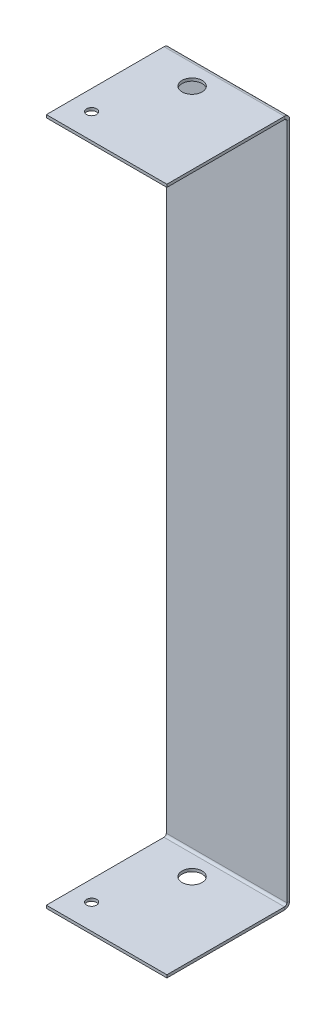
ISO-10303-21;
HEADER;
FILE_DESCRIPTION(('STEP AP214'),'2;1');
FILE_NAME('part.step','',(''),(''),'','','');
FILE_SCHEMA(('AUTOMOTIVE_DESIGN { 1 0 10303 214 1 1 1 1 }'));
ENDSEC;
DATA;
#1=APPLICATION_CONTEXT('core data for automotive mechanical design processes');
#2=APPLICATION_PROTOCOL_DEFINITION('international standard','automotive_design',2000,#1);
#3=PRODUCT_CONTEXT('',#1,'mechanical');
#4=PRODUCT('Part','Part','',(#3));
#5=PRODUCT_RELATED_PRODUCT_CATEGORY('part','',(#4));
#6=PRODUCT_DEFINITION_FORMATION('','',#4);
#7=PRODUCT_DEFINITION_CONTEXT('part definition',#1,'design');
#8=PRODUCT_DEFINITION('design','',#6,#7);
#9=PRODUCT_DEFINITION_SHAPE('','',#8);
#10=(LENGTH_UNIT() NAMED_UNIT(*) SI_UNIT(.MILLI.,.METRE.));
#11=(NAMED_UNIT(*) PLANE_ANGLE_UNIT() SI_UNIT($,.RADIAN.));
#12=(NAMED_UNIT(*) SI_UNIT($,.STERADIAN.) SOLID_ANGLE_UNIT());
#13=UNCERTAINTY_MEASURE_WITH_UNIT(LENGTH_MEASURE(1.E-05),#10,'distance_accuracy_value','');
#14=(GEOMETRIC_REPRESENTATION_CONTEXT(3) GLOBAL_UNCERTAINTY_ASSIGNED_CONTEXT((#13)) GLOBAL_UNIT_ASSIGNED_CONTEXT((#10,
#11,#12)) REPRESENTATION_CONTEXT('',''));
#15=CARTESIAN_POINT('',(0.,0.,0.));
#16=DIRECTION('',(0.,0.,1.));
#17=DIRECTION('',(1.,0.,0.));
#18=AXIS2_PLACEMENT_3D('',#15,#16,#17);
#19=CARTESIAN_POINT('',(0.,-107.758966229212,-108.141033770789));
#20=DIRECTION('',(0.,-1.,0.));
#21=DIRECTION('',(-1.,0.,0.));
#22=AXIS2_PLACEMENT_3D('',#19,#20,#21);
#23=PLANE('',#22);
#24=CARTESIAN_POINT('',(-12.6999999999976,-107.758966229211,29.9465999999943));
#25=DIRECTION('',(0.,1.,0.));
#26=DIRECTION('',(0.,0.,1.));
#27=AXIS2_PLACEMENT_3D('',#24,#25,#26);
#28=CIRCLE('',#27,1.58749999999999);
#29=CARTESIAN_POINT('',(-12.6999999999976,-107.758966229211,31.5340999999943));
#30=VERTEX_POINT('',#29);
#31=EDGE_CURVE('E337',#30,#30,#28,.T.);
#32=ORIENTED_EDGE('',*,*,#31,.F.);
#33=EDGE_LOOP('',(#32));
#34=FACE_BOUND('',#33,.T.);
#35=DIRECTION('',(0.,0.,-1.));
#36=VECTOR('',#35,1.);
#37=CARTESIAN_POINT('',(19.05,-107.758966229211,37.9089662292112));
#38=LINE('',#37,#36);
#39=CARTESIAN_POINT('',(19.05,-107.758966229211,37.9089662292112));
#40=VERTEX_POINT('',#39);
#41=CARTESIAN_POINT('',(19.05,-107.758966229211,0.736600000000004));
#42=VERTEX_POINT('',#41);
#43=EDGE_CURVE('E302',#40,#42,#38,.T.);
#44=ORIENTED_EDGE('',*,*,#43,.T.);
#45=DIRECTION('',(-1.,0.,0.));
#46=VECTOR('',#45,1.);
#47=CARTESIAN_POINT('',(0.,-107.758966229211,0.736600000000004));
#48=LINE('',#47,#46);
#49=CARTESIAN_POINT('',(-19.05,-107.758966229211,0.736600000000004));
#50=VERTEX_POINT('',#49);
#51=EDGE_CURVE('E309',#42,#50,#48,.T.);
#52=ORIENTED_EDGE('',*,*,#51,.T.);
#53=DIRECTION('',(0.,0.,1.));
#54=VECTOR('',#53,1.);
#55=CARTESIAN_POINT('',(-19.05,-107.758966229211,37.9089662292112));
#56=LINE('',#55,#54);
#57=CARTESIAN_POINT('',(-19.05,-107.758966229211,37.9089662292112));
#58=VERTEX_POINT('',#57);
#59=EDGE_CURVE('E311',#50,#58,#56,.T.);
#60=ORIENTED_EDGE('',*,*,#59,.T.);
#61=DIRECTION('',(1.,0.,0.));
#62=VECTOR('',#61,1.);
#63=CARTESIAN_POINT('',(-19.05,-107.758966229211,37.9089662292112));
#64=LINE('',#63,#62);
#65=EDGE_CURVE('E152',#58,#40,#64,.T.);
#66=ORIENTED_EDGE('',*,*,#65,.T.);
#67=EDGE_LOOP('',(#44,#52,#60,#66));
#68=FACE_BOUND('',#67,.T.);
#69=CARTESIAN_POINT('',(-3.80999999999361,-107.758966229211,7.08660000000428));
#70=DIRECTION('',(0.,1.,0.));
#71=DIRECTION('',(0.,0.,1.));
#72=AXIS2_PLACEMENT_3D('',#69,#70,#71);
#73=CIRCLE('',#72,3.17499999999999);
#74=CARTESIAN_POINT('',(-3.80999999999361,-107.758966229211,10.2616000000043));
#75=VERTEX_POINT('',#74);
#76=EDGE_CURVE('E331',#75,#75,#73,.T.);
#77=ORIENTED_EDGE('',*,*,#76,.F.);
#78=EDGE_LOOP('',(#77));
#79=FACE_BOUND('',#78,.T.);
#80=ADVANCED_FACE('F50',(#34,#68,#79),#23,.F.);
#81=CARTESIAN_POINT('',(0.,0.,-0.889));
#82=DIRECTION('',(0.,0.,-1.));
#83=DIRECTION('',(-1.,0.,0.));
#84=AXIS2_PLACEMENT_3D('',#81,#82,#83);
#85=PLANE('',#84);
#86=DIRECTION('',(0.,1.,0.));
#87=VECTOR('',#86,1.);
#88=CARTESIAN_POINT('',(19.05,-146.05,-0.889));
#89=LINE('',#88,#87);
#90=CARTESIAN_POINT('',(19.05,-107.022366229211,-0.889));
#91=VERTEX_POINT('',#90);
#92=CARTESIAN_POINT('',(19.05,107.022366229211,-0.889000000000002));
#93=VERTEX_POINT('',#92);
#94=EDGE_CURVE('E54',#91,#93,#89,.T.);
#95=ORIENTED_EDGE('',*,*,#94,.F.);
#96=DIRECTION('',(-1.,0.,0.));
#97=VECTOR('',#96,1.);
#98=CARTESIAN_POINT('',(0.,-107.022366229211,-0.889));
#99=LINE('',#98,#97);
#100=CARTESIAN_POINT('',(-19.05,-107.022366229211,-0.889));
#101=VERTEX_POINT('',#100);
#102=EDGE_CURVE('E235',#91,#101,#99,.T.);
#103=ORIENTED_EDGE('',*,*,#102,.T.);
#104=DIRECTION('',(0.,-1.,0.));
#105=VECTOR('',#104,1.);
#106=CARTESIAN_POINT('',(-19.05,-146.05,-0.889));
#107=LINE('',#106,#105);
#108=CARTESIAN_POINT('',(-19.05,107.022366229211,-0.889));
#109=VERTEX_POINT('',#108);
#110=EDGE_CURVE('E241',#109,#101,#107,.T.);
#111=ORIENTED_EDGE('',*,*,#110,.F.);
#112=DIRECTION('',(-1.,0.,0.));
#113=VECTOR('',#112,1.);
#114=CARTESIAN_POINT('',(0.,107.022366229211,-0.889));
#115=LINE('',#114,#113);
#116=EDGE_CURVE('E192',#93,#109,#115,.T.);
#117=ORIENTED_EDGE('',*,*,#116,.F.);
#118=EDGE_LOOP('',(#95,#103,#111,#117));
#119=FACE_BOUND('',#118,.T.);
#120=ADVANCED_FACE('F262',(#119),#85,.T.);
#121=CARTESIAN_POINT('',(19.05,-146.05,-0.889));
#122=DIRECTION('',(1.,0.,0.));
#123=DIRECTION('',(0.,0.,-1.));
#124=AXIS2_PLACEMENT_3D('',#121,#122,#123);
#125=PLANE('',#124);
#126=DIRECTION('',(0.,1.,0.));
#127=VECTOR('',#126,1.);
#128=CARTESIAN_POINT('',(19.05,-146.05,0.));
#129=LINE('',#128,#127);
#130=CARTESIAN_POINT('',(19.05,-107.022366229211,0.));
#131=VERTEX_POINT('',#130);
#132=CARTESIAN_POINT('',(19.05,107.022366229211,0.));
#133=VERTEX_POINT('',#132);
#134=EDGE_CURVE('E201',#131,#133,#129,.T.);
#135=ORIENTED_EDGE('',*,*,#134,.F.);
#136=DIRECTION('',(0.,0.,-1.));
#137=VECTOR('',#136,1.);
#138=CARTESIAN_POINT('',(19.05,-107.022366229211,-0.888999999999727));
#139=LINE('',#138,#137);
#140=EDGE_CURVE('E245',#131,#91,#139,.T.);
#141=ORIENTED_EDGE('',*,*,#140,.T.);
#142=ORIENTED_EDGE('',*,*,#94,.T.);
#143=DIRECTION('',(0.,0.,-1.));
#144=VECTOR('',#143,1.);
#145=CARTESIAN_POINT('',(19.05,107.022366229211,-0.888999999998233));
#146=LINE('',#145,#144);
#147=EDGE_CURVE('E202',#133,#93,#146,.T.);
#148=ORIENTED_EDGE('',*,*,#147,.F.);
#149=EDGE_LOOP('',(#135,#141,#142,#148));
#150=FACE_BOUND('',#149,.T.);
#151=ADVANCED_FACE('F259',(#150),#125,.T.);
#152=CARTESIAN_POINT('',(-19.05,-146.05,-0.889));
#153=DIRECTION('',(-1.,0.,0.));
#154=DIRECTION('',(0.,0.,1.));
#155=AXIS2_PLACEMENT_3D('',#152,#153,#154);
#156=PLANE('',#155);
#157=ORIENTED_EDGE('',*,*,#110,.T.);
#158=DIRECTION('',(0.,0.,1.));
#159=VECTOR('',#158,1.);
#160=CARTESIAN_POINT('',(-19.05,-107.022366229211,-0.888999999999727));
#161=LINE('',#160,#159);
#162=CARTESIAN_POINT('',(-19.05,-107.022366229211,0.));
#163=VERTEX_POINT('',#162);
#164=EDGE_CURVE('E12',#101,#163,#161,.T.);
#165=ORIENTED_EDGE('',*,*,#164,.T.);
#166=DIRECTION('',(0.,-1.,0.));
#167=VECTOR('',#166,1.);
#168=CARTESIAN_POINT('',(-19.05,-146.05,0.));
#169=LINE('',#168,#167);
#170=CARTESIAN_POINT('',(-19.05,107.022366229211,0.));
#171=VERTEX_POINT('',#170);
#172=EDGE_CURVE('E200',#171,#163,#169,.T.);
#173=ORIENTED_EDGE('',*,*,#172,.F.);
#174=DIRECTION('',(0.,0.,1.));
#175=VECTOR('',#174,1.);
#176=CARTESIAN_POINT('',(-19.05,107.022366229211,-0.888999999998233));
#177=LINE('',#176,#175);
#178=EDGE_CURVE('E205',#109,#171,#177,.T.);
#179=ORIENTED_EDGE('',*,*,#178,.F.);
#180=EDGE_LOOP('',(#157,#165,#173,#179));
#181=FACE_BOUND('',#180,.T.);
#182=ADVANCED_FACE('F52',(#181),#156,.T.);
#183=CARTESIAN_POINT('',(19.05,108.647966229212,-254.191033770789));
#184=DIRECTION('',(1.,0.,0.));
#185=DIRECTION('',(0.,1.,0.));
#186=AXIS2_PLACEMENT_3D('',#183,#184,#185);
#187=PLANE('',#186);
#188=DIRECTION('',(0.,0.,1.));
#189=VECTOR('',#188,1.);
#190=CARTESIAN_POINT('',(19.05,107.758966229212,-254.191033770789));
#191=LINE('',#190,#189);
#192=CARTESIAN_POINT('',(19.05,107.758966229211,0.736600000000029));
#193=VERTEX_POINT('',#192);
#194=CARTESIAN_POINT('',(19.05,107.758966229211,37.9089662292113));
#195=VERTEX_POINT('',#194);
#196=EDGE_CURVE('E218',#193,#195,#191,.T.);
#197=ORIENTED_EDGE('',*,*,#196,.F.);
#198=DIRECTION('',(0.,1.,0.));
#199=VECTOR('',#198,1.);
#200=CARTESIAN_POINT('',(19.05,108.64796622921,0.736600000000004));
#201=LINE('',#200,#199);
#202=CARTESIAN_POINT('',(19.05,108.647966229211,0.736600000000064));
#203=VERTEX_POINT('',#202);
#204=EDGE_CURVE('E227',#193,#203,#201,.T.);
#205=ORIENTED_EDGE('',*,*,#204,.T.);
#206=DIRECTION('',(0.,0.,1.));
#207=VECTOR('',#206,1.);
#208=CARTESIAN_POINT('',(19.05,108.647966229212,-254.191033770789));
#209=LINE('',#208,#207);
#210=CARTESIAN_POINT('',(19.05,108.647966229211,37.9089662292113));
#211=VERTEX_POINT('',#210);
#212=EDGE_CURVE('E213',#203,#211,#209,.T.);
#213=ORIENTED_EDGE('',*,*,#212,.T.);
#214=DIRECTION('',(0.,-1.,0.));
#215=VECTOR('',#214,1.);
#216=CARTESIAN_POINT('',(19.05,108.647966229211,37.9089662292113));
#217=LINE('',#216,#215);
#218=EDGE_CURVE('E222',#211,#195,#217,.T.);
#219=ORIENTED_EDGE('',*,*,#218,.T.);
#220=EDGE_LOOP('',(#197,#205,#213,#219));
#221=FACE_BOUND('',#220,.T.);
#222=ADVANCED_FACE('F283',(#221),#187,.T.);
#223=CARTESIAN_POINT('',(-19.05,108.647966229212,-254.191033770789));
#224=DIRECTION('',(-1.,0.,0.));
#225=DIRECTION('',(0.,-1.,0.));
#226=AXIS2_PLACEMENT_3D('',#223,#224,#225);
#227=PLANE('',#226);
#228=DIRECTION('',(0.,0.,-1.));
#229=VECTOR('',#228,1.);
#230=CARTESIAN_POINT('',(-19.05,108.647966229212,-254.191033770789));
#231=LINE('',#230,#229);
#232=CARTESIAN_POINT('',(-19.05,108.647966229211,37.9089662292113));
#233=VERTEX_POINT('',#232);
#234=CARTESIAN_POINT('',(-19.05,108.647966229211,0.736600000000004));
#235=VERTEX_POINT('',#234);
#236=EDGE_CURVE('E212',#233,#235,#231,.T.);
#237=ORIENTED_EDGE('',*,*,#236,.T.);
#238=DIRECTION('',(0.,-1.,0.));
#239=VECTOR('',#238,1.);
#240=CARTESIAN_POINT('',(-19.05,108.64796622921,0.736600000000004));
#241=LINE('',#240,#239);
#242=CARTESIAN_POINT('',(-19.05,107.758966229211,0.736600000000029));
#243=VERTEX_POINT('',#242);
#244=EDGE_CURVE('E232',#235,#243,#241,.T.);
#245=ORIENTED_EDGE('',*,*,#244,.T.);
#246=DIRECTION('',(0.,0.,-1.));
#247=VECTOR('',#246,1.);
#248=CARTESIAN_POINT('',(-19.05,107.758966229212,-254.191033770789));
#249=LINE('',#248,#247);
#250=CARTESIAN_POINT('',(-19.05,107.758966229211,37.9089662292113));
#251=VERTEX_POINT('',#250);
#252=EDGE_CURVE('E217',#251,#243,#249,.T.);
#253=ORIENTED_EDGE('',*,*,#252,.F.);
#254=DIRECTION('',(0.,-1.,0.));
#255=VECTOR('',#254,1.);
#256=CARTESIAN_POINT('',(-19.05,108.647966229211,37.9089662292113));
#257=LINE('',#256,#255);
#258=EDGE_CURVE('E219',#233,#251,#257,.T.);
#259=ORIENTED_EDGE('',*,*,#258,.F.);
#260=EDGE_LOOP('',(#237,#245,#253,#259));
#261=FACE_BOUND('',#260,.T.);
#262=ADVANCED_FACE('F275',(#261),#227,.T.);
#263=CARTESIAN_POINT('',(0.,108.647966229212,-108.141033770789));
#264=DIRECTION('',(0.,1.,0.));
#265=DIRECTION('',(-1.,0.,0.));
#266=AXIS2_PLACEMENT_3D('',#263,#264,#265);
#267=PLANE('',#266);
#268=CARTESIAN_POINT('',(-12.6999999999976,108.647966229211,29.9465999999943));
#269=DIRECTION('',(0.,-1.,0.));
#270=DIRECTION('',(0.,0.,-1.));
#271=AXIS2_PLACEMENT_3D('',#268,#269,#270);
#272=CIRCLE('',#271,1.5875);
#273=CARTESIAN_POINT('',(-12.6999999999976,108.647966229211,28.3590999999943));
#274=VERTEX_POINT('',#273);
#275=EDGE_CURVE('E322',#274,#274,#272,.T.);
#276=ORIENTED_EDGE('',*,*,#275,.T.);
#277=EDGE_LOOP('',(#276));
#278=FACE_BOUND('',#277,.T.);
#279=CARTESIAN_POINT('',(-3.80999999999361,108.647966229211,7.08660000000428));
#280=DIRECTION('',(0.,-1.,0.));
#281=DIRECTION('',(0.,0.,-1.));
#282=AXIS2_PLACEMENT_3D('',#279,#280,#281);
#283=CIRCLE('',#282,3.175);
#284=CARTESIAN_POINT('',(-3.80999999999361,108.647966229211,3.91160000000428));
#285=VERTEX_POINT('',#284);
#286=EDGE_CURVE('E176',#285,#285,#283,.T.);
#287=ORIENTED_EDGE('',*,*,#286,.T.);
#288=EDGE_LOOP('',(#287));
#289=FACE_BOUND('',#288,.T.);
#290=ORIENTED_EDGE('',*,*,#212,.F.);
#291=DIRECTION('',(-1.,0.,0.));
#292=VECTOR('',#291,1.);
#293=CARTESIAN_POINT('',(0.,108.647966229211,0.736599999999976));
#294=LINE('',#293,#292);
#295=EDGE_CURVE('E221',#203,#235,#294,.T.);
#296=ORIENTED_EDGE('',*,*,#295,.T.);
#297=ORIENTED_EDGE('',*,*,#236,.F.);
#298=DIRECTION('',(-1.,0.,0.));
#299=VECTOR('',#298,1.);
#300=CARTESIAN_POINT('',(-19.05,108.647966229211,37.9089662292113));
#301=LINE('',#300,#299);
#302=EDGE_CURVE('E209',#211,#233,#301,.T.);
#303=ORIENTED_EDGE('',*,*,#302,.F.);
#304=EDGE_LOOP('',(#290,#296,#297,#303));
#305=FACE_BOUND('',#304,.T.);
#306=ADVANCED_FACE('F272',(#278,#289,#305),#267,.T.);
#307=CARTESIAN_POINT('',(-19.05,108.647966229211,37.9089662292113));
#308=DIRECTION('',(0.,0.,1.));
#309=DIRECTION('',(0.,-1.,0.));
#310=AXIS2_PLACEMENT_3D('',#307,#308,#309);
#311=PLANE('',#310);
#312=DIRECTION('',(-1.,0.,0.));
#313=VECTOR('',#312,1.);
#314=CARTESIAN_POINT('',(-19.05,107.758966229211,37.9089662292113));
#315=LINE('',#314,#313);
#316=EDGE_CURVE('E214',#195,#251,#315,.T.);
#317=ORIENTED_EDGE('',*,*,#316,.F.);
#318=ORIENTED_EDGE('',*,*,#218,.F.);
#319=ORIENTED_EDGE('',*,*,#302,.T.);
#320=ORIENTED_EDGE('',*,*,#258,.T.);
#321=EDGE_LOOP('',(#317,#318,#319,#320));
#322=FACE_BOUND('',#321,.T.);
#323=ADVANCED_FACE('F279',(#322),#311,.T.);
#324=CARTESIAN_POINT('',(0.,107.758966229212,-108.141033770789));
#325=DIRECTION('',(0.,1.,0.));
#326=DIRECTION('',(-1.,0.,0.));
#327=AXIS2_PLACEMENT_3D('',#324,#325,#326);
#328=PLANE('',#327);
#329=CARTESIAN_POINT('',(-12.6999999999976,107.758966229211,29.9465999999943));
#330=DIRECTION('',(0.,-1.,0.));
#331=DIRECTION('',(0.,0.,-1.));
#332=AXIS2_PLACEMENT_3D('',#329,#330,#331);
#333=CIRCLE('',#332,1.58749999999999);
#334=CARTESIAN_POINT('',(-12.6999999999976,107.758966229211,28.3590999999943));
#335=VERTEX_POINT('',#334);
#336=EDGE_CURVE('E325',#335,#335,#333,.T.);
#337=ORIENTED_EDGE('',*,*,#336,.F.);
#338=EDGE_LOOP('',(#337));
#339=FACE_BOUND('',#338,.T.);
#340=CARTESIAN_POINT('',(-3.80999999999361,107.758966229211,7.08660000000428));
#341=DIRECTION('',(0.,-1.,0.));
#342=DIRECTION('',(0.,0.,-1.));
#343=AXIS2_PLACEMENT_3D('',#340,#341,#342);
#344=CIRCLE('',#343,3.17499999999999);
#345=CARTESIAN_POINT('',(-3.80999999999361,107.758966229211,3.91160000000429));
#346=VERTEX_POINT('',#345);
#347=EDGE_CURVE('E319',#346,#346,#344,.T.);
#348=ORIENTED_EDGE('',*,*,#347,.F.);
#349=EDGE_LOOP('',(#348));
#350=FACE_BOUND('',#349,.T.);
#351=DIRECTION('',(-1.,0.,0.));
#352=VECTOR('',#351,1.);
#353=CARTESIAN_POINT('',(0.,107.758966229211,0.736599999999976));
#354=LINE('',#353,#352);
#355=EDGE_CURVE('E230',#193,#243,#354,.T.);
#356=ORIENTED_EDGE('',*,*,#355,.F.);
#357=ORIENTED_EDGE('',*,*,#196,.T.);
#358=ORIENTED_EDGE('',*,*,#316,.T.);
#359=ORIENTED_EDGE('',*,*,#252,.T.);
#360=EDGE_LOOP('',(#356,#357,#358,#359));
#361=FACE_BOUND('',#360,.T.);
#362=ADVANCED_FACE('F394',(#339,#350,#361),#328,.F.);
#363=CARTESIAN_POINT('',(0.,0.,0.));
#364=DIRECTION('',(0.,0.,-1.));
#365=DIRECTION('',(-1.,0.,0.));
#366=AXIS2_PLACEMENT_3D('',#363,#364,#365);
#367=PLANE('',#366);
#368=DIRECTION('',(-1.,0.,0.));
#369=VECTOR('',#368,1.);
#370=CARTESIAN_POINT('',(0.,-107.022366229211,0.));
#371=LINE('',#370,#369);
#372=EDGE_CURVE('E59',#131,#163,#371,.T.);
#373=ORIENTED_EDGE('',*,*,#372,.F.);
#374=ORIENTED_EDGE('',*,*,#134,.T.);
#375=DIRECTION('',(-1.,0.,0.));
#376=VECTOR('',#375,1.);
#377=CARTESIAN_POINT('',(0.,107.022366229211,0.));
#378=LINE('',#377,#376);
#379=EDGE_CURVE('E197',#133,#171,#378,.T.);
#380=ORIENTED_EDGE('',*,*,#379,.T.);
#381=ORIENTED_EDGE('',*,*,#172,.T.);
#382=EDGE_LOOP('',(#373,#374,#380,#381));
#383=FACE_BOUND('',#382,.T.);
#384=ADVANCED_FACE('F288',(#383),#367,.F.);
#385=CARTESIAN_POINT('',(19.05,107.022366229211,0.7366));
#386=DIRECTION('',(1.,0.,0.));
#387=DIRECTION('',(0.,0.,-1.));
#388=AXIS2_PLACEMENT_3D('',#385,#386,#387);
#389=PLANE('',#388);
#390=ORIENTED_EDGE('',*,*,#204,.F.);
#391=CARTESIAN_POINT('',(19.05,107.022366229211,0.7366));
#392=DIRECTION('',(1.,0.,0.));
#393=DIRECTION('',(0.,0.,-1.));
#394=AXIS2_PLACEMENT_3D('',#391,#392,#393);
#395=CIRCLE('',#394,0.7366);
#396=EDGE_CURVE('E183',#193,#133,#395,.F.);
#397=ORIENTED_EDGE('',*,*,#396,.T.);
#398=ORIENTED_EDGE('',*,*,#147,.T.);
#399=CARTESIAN_POINT('',(19.05,107.022366229211,0.7366));
#400=DIRECTION('',(-1.,0.,0.));
#401=DIRECTION('',(0.,0.,-1.));
#402=AXIS2_PLACEMENT_3D('',#399,#400,#401);
#403=CIRCLE('',#402,1.6256);
#404=EDGE_CURVE('E187',#203,#93,#403,.T.);
#405=ORIENTED_EDGE('',*,*,#404,.F.);
#406=EDGE_LOOP('',(#390,#397,#398,#405));
#407=FACE_BOUND('',#406,.T.);
#408=ADVANCED_FACE('F266',(#407),#389,.T.);
#409=CARTESIAN_POINT('',(-19.05,107.022366229211,0.7366));
#410=DIRECTION('',(-1.,0.,0.));
#411=DIRECTION('',(0.,0.,1.));
#412=AXIS2_PLACEMENT_3D('',#409,#410,#411);
#413=PLANE('',#412);
#414=CARTESIAN_POINT('',(-19.05,107.022366229211,0.7366));
#415=DIRECTION('',(1.,0.,0.));
#416=DIRECTION('',(0.,0.,-1.));
#417=AXIS2_PLACEMENT_3D('',#414,#415,#416);
#418=CIRCLE('',#417,0.7366);
#419=EDGE_CURVE('E190',#171,#243,#418,.T.);
#420=ORIENTED_EDGE('',*,*,#419,.T.);
#421=ORIENTED_EDGE('',*,*,#244,.F.);
#422=CARTESIAN_POINT('',(-19.05,107.022366229211,0.7366));
#423=DIRECTION('',(1.,0.,0.));
#424=DIRECTION('',(0.,0.,1.));
#425=AXIS2_PLACEMENT_3D('',#422,#423,#424);
#426=CIRCLE('',#425,1.6256);
#427=EDGE_CURVE('E75',#109,#235,#426,.T.);
#428=ORIENTED_EDGE('',*,*,#427,.F.);
#429=ORIENTED_EDGE('',*,*,#178,.T.);
#430=EDGE_LOOP('',(#420,#421,#428,#429));
#431=FACE_BOUND('',#430,.T.);
#432=ADVANCED_FACE('F290',(#431),#413,.T.);
#433=CARTESIAN_POINT('',(-38.1555020757273,107.022366229211,0.7366));
#434=DIRECTION('',(1.,0.,0.));
#435=DIRECTION('',(0.,0.,-1.));
#436=AXIS2_PLACEMENT_3D('',#433,#434,#435);
#437=CYLINDRICAL_SURFACE('',#436,1.6256);
#438=ORIENTED_EDGE('',*,*,#116,.T.);
#439=ORIENTED_EDGE('',*,*,#427,.T.);
#440=ORIENTED_EDGE('',*,*,#295,.F.);
#441=ORIENTED_EDGE('',*,*,#404,.T.);
#442=EDGE_LOOP('',(#438,#439,#440,#441));
#443=FACE_BOUND('',#442,.T.);
#444=ADVANCED_FACE('F269',(#443),#437,.T.);
#445=CARTESIAN_POINT('',(-38.1555020757273,107.022366229211,0.7366));
#446=DIRECTION('',(1.,0.,0.));
#447=DIRECTION('',(0.,0.,-1.));
#448=AXIS2_PLACEMENT_3D('',#445,#446,#447);
#449=CYLINDRICAL_SURFACE('',#448,0.7366);
#450=ORIENTED_EDGE('',*,*,#379,.F.);
#451=ORIENTED_EDGE('',*,*,#396,.F.);
#452=ORIENTED_EDGE('',*,*,#355,.T.);
#453=ORIENTED_EDGE('',*,*,#419,.F.);
#454=EDGE_LOOP('',(#450,#451,#452,#453));
#455=FACE_BOUND('',#454,.T.);
#456=ADVANCED_FACE('F286',(#455),#449,.F.);
#457=CARTESIAN_POINT('',(19.05,-107.022366229211,0.7366));
#458=DIRECTION('',(1.,0.,0.));
#459=DIRECTION('',(0.,0.,-1.));
#460=AXIS2_PLACEMENT_3D('',#457,#458,#459);
#461=PLANE('',#460);
#462=ORIENTED_EDGE('',*,*,#140,.F.);
#463=CARTESIAN_POINT('',(19.05,-107.022366229211,0.7366));
#464=DIRECTION('',(-1.,0.,0.));
#465=DIRECTION('',(0.,0.,1.));
#466=AXIS2_PLACEMENT_3D('',#463,#464,#465);
#467=CIRCLE('',#466,0.7366);
#468=EDGE_CURVE('E159',#131,#42,#467,.T.);
#469=ORIENTED_EDGE('',*,*,#468,.T.);
#470=DIRECTION('',(0.,-1.,0.));
#471=VECTOR('',#470,1.);
#472=CARTESIAN_POINT('',(19.05,-108.647966229211,0.736600000000004));
#473=LINE('',#472,#471);
#474=CARTESIAN_POINT('',(19.05,-108.647966229211,0.736600000000004));
#475=VERTEX_POINT('',#474);
#476=EDGE_CURVE('E166',#42,#475,#473,.T.);
#477=ORIENTED_EDGE('',*,*,#476,.T.);
#478=CARTESIAN_POINT('',(19.05,-107.022366229211,0.7366));
#479=DIRECTION('',(-1.,0.,0.));
#480=DIRECTION('',(0.,0.,-1.));
#481=AXIS2_PLACEMENT_3D('',#478,#479,#480);
#482=CIRCLE('',#481,1.6256);
#483=EDGE_CURVE('E177',#91,#475,#482,.T.);
#484=ORIENTED_EDGE('',*,*,#483,.F.);
#485=EDGE_LOOP('',(#462,#469,#477,#484));
#486=FACE_BOUND('',#485,.T.);
#487=ADVANCED_FACE('F304',(#486),#461,.T.);
#488=CARTESIAN_POINT('',(-19.05,-107.022366229211,0.7366));
#489=DIRECTION('',(-1.,0.,0.));
#490=DIRECTION('',(0.,0.,1.));
#491=AXIS2_PLACEMENT_3D('',#488,#489,#490);
#492=PLANE('',#491);
#493=CARTESIAN_POINT('',(-19.05,-107.022366229211,0.7366));
#494=DIRECTION('',(-1.,0.,0.));
#495=DIRECTION('',(0.,0.,1.));
#496=AXIS2_PLACEMENT_3D('',#493,#494,#495);
#497=CIRCLE('',#496,0.7366);
#498=EDGE_CURVE('E67',#50,#163,#497,.F.);
#499=ORIENTED_EDGE('',*,*,#498,.T.);
#500=ORIENTED_EDGE('',*,*,#164,.F.);
#501=CARTESIAN_POINT('',(-19.05,-107.022366229211,0.7366));
#502=DIRECTION('',(1.,0.,0.));
#503=DIRECTION('',(0.,0.,1.));
#504=AXIS2_PLACEMENT_3D('',#501,#502,#503);
#505=CIRCLE('',#504,1.6256);
#506=CARTESIAN_POINT('',(-19.05,-108.647966229211,0.736599999999988));
#507=VERTEX_POINT('',#506);
#508=EDGE_CURVE('E180',#507,#101,#505,.T.);
#509=ORIENTED_EDGE('',*,*,#508,.F.);
#510=DIRECTION('',(0.,1.,0.));
#511=VECTOR('',#510,1.);
#512=CARTESIAN_POINT('',(-19.05,-108.647966229211,0.736600000000004));
#513=LINE('',#512,#511);
#514=EDGE_CURVE('E148',#507,#50,#513,.T.);
#515=ORIENTED_EDGE('',*,*,#514,.T.);
#516=EDGE_LOOP('',(#499,#500,#509,#515));
#517=FACE_BOUND('',#516,.T.);
#518=ADVANCED_FACE('F293',(#517),#492,.T.);
#519=CARTESIAN_POINT('',(38.1555020757273,-107.022366229211,0.7366));
#520=DIRECTION('',(-1.,0.,0.));
#521=DIRECTION('',(0.,0.,1.));
#522=AXIS2_PLACEMENT_3D('',#519,#520,#521);
#523=CYLINDRICAL_SURFACE('',#522,1.6256);
#524=DIRECTION('',(-1.,0.,0.));
#525=VECTOR('',#524,1.);
#526=CARTESIAN_POINT('',(0.,-108.647966229211,0.736600000000004));
#527=LINE('',#526,#525);
#528=EDGE_CURVE('E174',#475,#507,#527,.T.);
#529=ORIENTED_EDGE('',*,*,#528,.T.);
#530=ORIENTED_EDGE('',*,*,#508,.T.);
#531=ORIENTED_EDGE('',*,*,#102,.F.);
#532=ORIENTED_EDGE('',*,*,#483,.T.);
#533=EDGE_LOOP('',(#529,#530,#531,#532));
#534=FACE_BOUND('',#533,.T.);
#535=ADVANCED_FACE('F295',(#534),#523,.T.);
#536=CARTESIAN_POINT('',(38.1555020757273,-107.022366229211,0.7366));
#537=DIRECTION('',(-1.,0.,0.));
#538=DIRECTION('',(0.,0.,1.));
#539=AXIS2_PLACEMENT_3D('',#536,#537,#538);
#540=CYLINDRICAL_SURFACE('',#539,0.7366);
#541=ORIENTED_EDGE('',*,*,#51,.F.);
#542=ORIENTED_EDGE('',*,*,#468,.F.);
#543=ORIENTED_EDGE('',*,*,#372,.T.);
#544=ORIENTED_EDGE('',*,*,#498,.F.);
#545=EDGE_LOOP('',(#541,#542,#543,#544));
#546=FACE_BOUND('',#545,.T.);
#547=ADVANCED_FACE('F307',(#546),#540,.F.);
#548=CARTESIAN_POINT('',(-19.05,-108.647966229211,37.9089662292112));
#549=DIRECTION('',(0.,0.,1.));
#550=DIRECTION('',(0.,-1.,0.));
#551=AXIS2_PLACEMENT_3D('',#548,#549,#550);
#552=PLANE('',#551);
#553=ORIENTED_EDGE('',*,*,#65,.F.);
#554=DIRECTION('',(0.,1.,0.));
#555=VECTOR('',#554,1.);
#556=CARTESIAN_POINT('',(-19.05,-108.647966229211,37.9089662292112));
#557=LINE('',#556,#555);
#558=CARTESIAN_POINT('',(-19.05,-108.647966229211,37.9089662292112));
#559=VERTEX_POINT('',#558);
#560=EDGE_CURVE('E146',#559,#58,#557,.T.);
#561=ORIENTED_EDGE('',*,*,#560,.F.);
#562=DIRECTION('',(1.,0.,0.));
#563=VECTOR('',#562,1.);
#564=CARTESIAN_POINT('',(-19.05,-108.647966229211,37.9089662292112));
#565=LINE('',#564,#563);
#566=CARTESIAN_POINT('',(19.05,-108.647966229211,37.9089662292112));
#567=VERTEX_POINT('',#566);
#568=EDGE_CURVE('E157',#559,#567,#565,.T.);
#569=ORIENTED_EDGE('',*,*,#568,.T.);
#570=DIRECTION('',(0.,1.,0.));
#571=VECTOR('',#570,1.);
#572=CARTESIAN_POINT('',(19.05,-108.647966229211,37.9089662292112));
#573=LINE('',#572,#571);
#574=EDGE_CURVE('E165',#567,#40,#573,.T.);
#575=ORIENTED_EDGE('',*,*,#574,.T.);
#576=EDGE_LOOP('',(#553,#561,#569,#575));
#577=FACE_BOUND('',#576,.T.);
#578=ADVANCED_FACE('F156',(#577),#552,.T.);
#579=CARTESIAN_POINT('',(0.,-108.647966229212,-108.141033770789));
#580=DIRECTION('',(0.,-1.,0.));
#581=DIRECTION('',(-1.,0.,0.));
#582=AXIS2_PLACEMENT_3D('',#579,#580,#581);
#583=PLANE('',#582);
#584=CARTESIAN_POINT('',(-12.6999999999976,-108.647966229211,29.9465999999943));
#585=DIRECTION('',(0.,1.,0.));
#586=DIRECTION('',(0.,0.,1.));
#587=AXIS2_PLACEMENT_3D('',#584,#585,#586);
#588=CIRCLE('',#587,1.5875);
#589=CARTESIAN_POINT('',(-12.6999999999976,-108.647966229211,31.5340999999943));
#590=VERTEX_POINT('',#589);
#591=EDGE_CURVE('E334',#590,#590,#588,.T.);
#592=ORIENTED_EDGE('',*,*,#591,.T.);
#593=EDGE_LOOP('',(#592));
#594=FACE_BOUND('',#593,.T.);
#595=CARTESIAN_POINT('',(-3.80999999999361,-108.647966229211,7.08660000000429));
#596=DIRECTION('',(0.,1.,0.));
#597=DIRECTION('',(0.,0.,1.));
#598=AXIS2_PLACEMENT_3D('',#595,#596,#597);
#599=CIRCLE('',#598,3.175);
#600=CARTESIAN_POINT('',(-3.80999999999361,-108.647966229211,10.2616000000043));
#601=VERTEX_POINT('',#600);
#602=EDGE_CURVE('E328',#601,#601,#599,.T.);
#603=ORIENTED_EDGE('',*,*,#602,.T.);
#604=EDGE_LOOP('',(#603));
#605=FACE_BOUND('',#604,.T.);
#606=ORIENTED_EDGE('',*,*,#528,.F.);
#607=DIRECTION('',(0.,0.,-1.));
#608=VECTOR('',#607,1.);
#609=CARTESIAN_POINT('',(19.05,-108.647966229211,37.9089662292112));
#610=LINE('',#609,#608);
#611=EDGE_CURVE('E164',#567,#475,#610,.T.);
#612=ORIENTED_EDGE('',*,*,#611,.F.);
#613=ORIENTED_EDGE('',*,*,#568,.F.);
#614=DIRECTION('',(0.,0.,1.));
#615=VECTOR('',#614,1.);
#616=CARTESIAN_POINT('',(-19.05,-108.647966229211,37.9089662292112));
#617=LINE('',#616,#615);
#618=EDGE_CURVE('E143',#507,#559,#617,.T.);
#619=ORIENTED_EDGE('',*,*,#618,.F.);
#620=EDGE_LOOP('',(#606,#612,#613,#619));
#621=FACE_BOUND('',#620,.T.);
#622=ADVANCED_FACE('F162',(#594,#605,#621),#583,.T.);
#623=CARTESIAN_POINT('',(19.05,-108.647966229211,37.9089662292112));
#624=DIRECTION('',(1.,0.,0.));
#625=DIRECTION('',(0.,-1.,0.));
#626=AXIS2_PLACEMENT_3D('',#623,#624,#625);
#627=PLANE('',#626);
#628=ORIENTED_EDGE('',*,*,#476,.F.);
#629=ORIENTED_EDGE('',*,*,#43,.F.);
#630=ORIENTED_EDGE('',*,*,#574,.F.);
#631=ORIENTED_EDGE('',*,*,#611,.T.);
#632=EDGE_LOOP('',(#628,#629,#630,#631));
#633=FACE_BOUND('',#632,.T.);
#634=ADVANCED_FACE('F299',(#633),#627,.T.);
#635=CARTESIAN_POINT('',(-19.05,-108.647966229211,37.9089662292112));
#636=DIRECTION('',(-1.,0.,0.));
#637=DIRECTION('',(0.,1.,0.));
#638=AXIS2_PLACEMENT_3D('',#635,#636,#637);
#639=PLANE('',#638);
#640=ORIENTED_EDGE('',*,*,#514,.F.);
#641=ORIENTED_EDGE('',*,*,#618,.T.);
#642=ORIENTED_EDGE('',*,*,#560,.T.);
#643=ORIENTED_EDGE('',*,*,#59,.F.);
#644=EDGE_LOOP('',(#640,#641,#642,#643));
#645=FACE_BOUND('',#644,.T.);
#646=ADVANCED_FACE('F145',(#645),#639,.T.);
#647=CARTESIAN_POINT('',(-3.80999999999361,107.758966229211,7.08660000000428));
#648=DIRECTION('',(0.,-1.,0.));
#649=DIRECTION('',(0.,0.,-1.));
#650=AXIS2_PLACEMENT_3D('',#647,#648,#649);
#651=CYLINDRICAL_SURFACE('',#650,3.17499999999999);
#652=ORIENTED_EDGE('',*,*,#286,.F.);
#653=EDGE_LOOP('',(#652));
#654=FACE_BOUND('',#653,.T.);
#655=ORIENTED_EDGE('',*,*,#347,.T.);
#656=EDGE_LOOP('',(#655));
#657=FACE_BOUND('',#656,.T.);
#658=ADVANCED_FACE('F359',(#654,#657),#651,.F.);
#659=CARTESIAN_POINT('',(-12.6999999999976,107.758966229211,29.9465999999943));
#660=DIRECTION('',(0.,-1.,0.));
#661=DIRECTION('',(0.,0.,-1.));
#662=AXIS2_PLACEMENT_3D('',#659,#660,#661);
#663=CYLINDRICAL_SURFACE('',#662,1.58749999999999);
#664=ORIENTED_EDGE('',*,*,#275,.F.);
#665=EDGE_LOOP('',(#664));
#666=FACE_BOUND('',#665,.T.);
#667=ORIENTED_EDGE('',*,*,#336,.T.);
#668=EDGE_LOOP('',(#667));
#669=FACE_BOUND('',#668,.T.);
#670=ADVANCED_FACE('F350',(#666,#669),#663,.F.);
#671=CARTESIAN_POINT('',(-3.80999999999361,-107.758966229211,7.08660000000428));
#672=DIRECTION('',(0.,1.,0.));
#673=DIRECTION('',(0.,0.,1.));
#674=AXIS2_PLACEMENT_3D('',#671,#672,#673);
#675=CYLINDRICAL_SURFACE('',#674,3.17499999999999);
#676=ORIENTED_EDGE('',*,*,#602,.F.);
#677=EDGE_LOOP('',(#676));
#678=FACE_BOUND('',#677,.T.);
#679=ORIENTED_EDGE('',*,*,#76,.T.);
#680=EDGE_LOOP('',(#679));
#681=FACE_BOUND('',#680,.T.);
#682=ADVANCED_FACE('F348',(#678,#681),#675,.F.);
#683=CARTESIAN_POINT('',(-12.6999999999976,-107.758966229211,29.9465999999943));
#684=DIRECTION('',(0.,1.,0.));
#685=DIRECTION('',(0.,0.,1.));
#686=AXIS2_PLACEMENT_3D('',#683,#684,#685);
#687=CYLINDRICAL_SURFACE('',#686,1.58749999999999);
#688=ORIENTED_EDGE('',*,*,#591,.F.);
#689=EDGE_LOOP('',(#688));
#690=FACE_BOUND('',#689,.T.);
#691=ORIENTED_EDGE('',*,*,#31,.T.);
#692=EDGE_LOOP('',(#691));
#693=FACE_BOUND('',#692,.T.);
#694=ADVANCED_FACE('F341',(#690,#693),#687,.F.);
#695=CLOSED_SHELL('',(#80,#120,#151,#182,#222,#262,#306,#323,#362,#384,#408,#432,#444,#456,#487,
#518,#535,#547,#578,#622,#634,#646,#658,#670,#682,#694));
#696=MANIFOLD_SOLID_BREP('B2',#695);
#697=ADVANCED_BREP_SHAPE_REPRESENTATION('',(#18,#696),#14);
#698=SHAPE_DEFINITION_REPRESENTATION(#9,#697);
ENDSEC;
END-ISO-10303-21;
